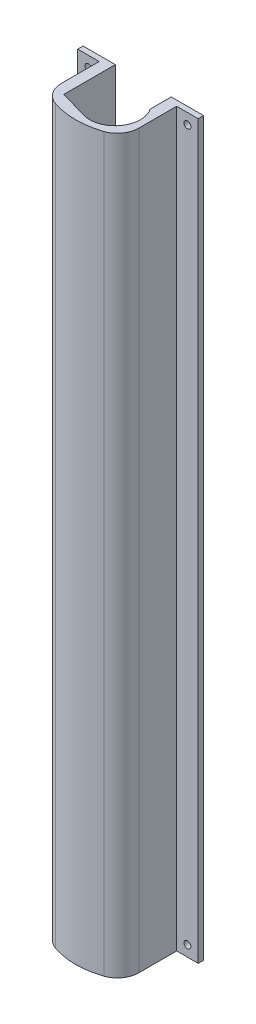
ISO-10303-21;
HEADER;
FILE_DESCRIPTION(('STEP AP214'),'2;1');
FILE_NAME('part.step','',(''),(''),'','','');
FILE_SCHEMA(('AUTOMOTIVE_DESIGN { 1 0 10303 214 1 1 1 1 }'));
ENDSEC;
DATA;
#1=APPLICATION_CONTEXT('core data for automotive mechanical design processes');
#2=APPLICATION_PROTOCOL_DEFINITION('international standard','automotive_design',2000,#1);
#3=PRODUCT_CONTEXT('',#1,'mechanical');
#4=PRODUCT('Part','Part','',(#3));
#5=PRODUCT_RELATED_PRODUCT_CATEGORY('part','',(#4));
#6=PRODUCT_DEFINITION_FORMATION('','',#4);
#7=PRODUCT_DEFINITION_CONTEXT('part definition',#1,'design');
#8=PRODUCT_DEFINITION('design','',#6,#7);
#9=PRODUCT_DEFINITION_SHAPE('','',#8);
#10=(LENGTH_UNIT() NAMED_UNIT(*) SI_UNIT(.MILLI.,.METRE.));
#11=(NAMED_UNIT(*) PLANE_ANGLE_UNIT() SI_UNIT($,.RADIAN.));
#12=(NAMED_UNIT(*) SI_UNIT($,.STERADIAN.) SOLID_ANGLE_UNIT());
#13=UNCERTAINTY_MEASURE_WITH_UNIT(LENGTH_MEASURE(1.E-05),#10,'distance_accuracy_value','');
#14=(GEOMETRIC_REPRESENTATION_CONTEXT(3) GLOBAL_UNCERTAINTY_ASSIGNED_CONTEXT((#13)) GLOBAL_UNIT_ASSIGNED_CONTEXT((#10,
#11,#12)) REPRESENTATION_CONTEXT('',''));
#15=CARTESIAN_POINT('',(0.,0.,0.));
#16=DIRECTION('',(0.,0.,1.));
#17=DIRECTION('',(1.,0.,0.));
#18=AXIS2_PLACEMENT_3D('',#15,#16,#17);
#19=CARTESIAN_POINT('',(-8.97623925243641,269.875,-3.02552306667417));
#20=DIRECTION('',(-1.,0.,0.));
#21=DIRECTION('',(0.,0.,1.));
#22=AXIS2_PLACEMENT_3D('',#19,#20,#21);
#23=PLANE('',#22);
#24=DIRECTION('',(0.,0.,-1.));
#25=VECTOR('',#24,1.);
#26=CARTESIAN_POINT('',(-8.97623925243641,161.925,-3.02552306667417));
#27=LINE('',#26,#25);
#28=CARTESIAN_POINT('',(-8.97623925243641,161.925,1.80050933441853));
#29=VERTEX_POINT('',#28);
#30=CARTESIAN_POINT('',(-8.97623925243641,161.925,-5.79920128845679));
#31=VERTEX_POINT('',#30);
#32=EDGE_CURVE('E160',#29,#31,#27,.T.);
#33=ORIENTED_EDGE('',*,*,#32,.T.);
#34=DIRECTION('',(0.,-1.,0.));
#35=VECTOR('',#34,1.);
#36=CARTESIAN_POINT('',(-8.97623925243641,269.875,-5.79920128845679));
#37=LINE('',#36,#35);
#38=CARTESIAN_POINT('',(-8.97623925243641,269.875,-5.79920128845679));
#39=VERTEX_POINT('',#38);
#40=EDGE_CURVE('E159',#39,#31,#37,.T.);
#41=ORIENTED_EDGE('',*,*,#40,.F.);
#42=DIRECTION('',(0.,0.,-1.));
#43=VECTOR('',#42,1.);
#44=CARTESIAN_POINT('',(-8.97623925243641,269.875,-3.02552306667417));
#45=LINE('',#44,#43);
#46=CARTESIAN_POINT('',(-8.97623925243641,269.875,1.80050933441853));
#47=VERTEX_POINT('',#46);
#48=EDGE_CURVE('E145',#47,#39,#45,.T.);
#49=ORIENTED_EDGE('',*,*,#48,.F.);
#50=DIRECTION('',(0.,-1.,0.));
#51=VECTOR('',#50,1.);
#52=CARTESIAN_POINT('',(-8.97623925243641,269.875,1.80050933441853));
#53=LINE('',#52,#51);
#54=EDGE_CURVE('E193',#47,#29,#53,.T.);
#55=ORIENTED_EDGE('',*,*,#54,.T.);
#56=EDGE_LOOP('',(#33,#41,#49,#55));
#57=FACE_BOUND('',#56,.T.);
#58=ADVANCED_FACE('F37',(#57),#23,.F.);
#59=CARTESIAN_POINT('',(-13.7387392524364,269.875,-5.79920128845679));
#60=DIRECTION('',(0.,0.,1.));
#61=DIRECTION('',(1.,0.,0.));
#62=AXIS2_PLACEMENT_3D('',#59,#60,#61);
#63=PLANE('',#62);
#64=CARTESIAN_POINT('',(-12.1512392524364,163.5125,-5.79920128845679));
#65=DIRECTION('',(0.,0.,1.));
#66=DIRECTION('',(1.,0.,0.));
#67=AXIS2_PLACEMENT_3D('',#64,#65,#66);
#68=CIRCLE('',#67,0.508);
#69=CARTESIAN_POINT('',(-11.6432392524364,163.5125,-5.79920128845679));
#70=VERTEX_POINT('',#69);
#71=EDGE_CURVE('E491',#70,#70,#68,.T.);
#72=ORIENTED_EDGE('',*,*,#71,.T.);
#73=EDGE_LOOP('',(#72));
#74=FACE_BOUND('',#73,.T.);
#75=CARTESIAN_POINT('',(-12.1512392524364,268.2875,-5.79920128845679));
#76=DIRECTION('',(0.,0.,1.));
#77=DIRECTION('',(1.,0.,0.));
#78=AXIS2_PLACEMENT_3D('',#75,#76,#77);
#79=CIRCLE('',#78,0.508000000000003);
#80=CARTESIAN_POINT('',(-11.6432392524364,268.2875,-5.79920128845679));
#81=VERTEX_POINT('',#80);
#82=EDGE_CURVE('E196',#81,#81,#79,.T.);
#83=ORIENTED_EDGE('',*,*,#82,.T.);
#84=EDGE_LOOP('',(#83));
#85=FACE_BOUND('',#84,.T.);
#86=DIRECTION('',(-1.,0.,0.));
#87=VECTOR('',#86,1.);
#88=CARTESIAN_POINT('',(-13.7387392524364,161.925,-5.79920128845679));
#89=LINE('',#88,#87);
#90=CARTESIAN_POINT('',(-13.7387392524364,161.925,-5.79920128845679));
#91=VERTEX_POINT('',#90);
#92=EDGE_CURVE('E195',#31,#91,#89,.T.);
#93=ORIENTED_EDGE('',*,*,#92,.T.);
#94=DIRECTION('',(0.,-1.,0.));
#95=VECTOR('',#94,1.);
#96=CARTESIAN_POINT('',(-13.7387392524364,269.875,-5.79920128845679));
#97=LINE('',#96,#95);
#98=CARTESIAN_POINT('',(-13.7387392524364,269.875,-5.79920128845679));
#99=VERTEX_POINT('',#98);
#100=EDGE_CURVE('E164',#99,#91,#97,.T.);
#101=ORIENTED_EDGE('',*,*,#100,.F.);
#102=DIRECTION('',(-1.,0.,0.));
#103=VECTOR('',#102,1.);
#104=CARTESIAN_POINT('',(-13.7387392524364,269.875,-5.79920128845679));
#105=LINE('',#104,#103);
#106=EDGE_CURVE('E149',#39,#99,#105,.T.);
#107=ORIENTED_EDGE('',*,*,#106,.F.);
#108=ORIENTED_EDGE('',*,*,#40,.T.);
#109=EDGE_LOOP('',(#93,#101,#107,#108));
#110=FACE_BOUND('',#109,.T.);
#111=ADVANCED_FACE('F166',(#74,#85,#110),#63,.F.);
#112=CARTESIAN_POINT('',(-13.7387392524364,269.875,-5.79920128845679));
#113=DIRECTION('',(1.,0.,0.));
#114=DIRECTION('',(0.,0.,-1.));
#115=AXIS2_PLACEMENT_3D('',#112,#113,#114);
#116=PLANE('',#115);
#117=DIRECTION('',(0.,0.,1.));
#118=VECTOR('',#117,1.);
#119=CARTESIAN_POINT('',(-13.7387392524364,161.925,-5.79920128845679));
#120=LINE('',#119,#118);
#121=CARTESIAN_POINT('',(-13.7387392524364,161.925,-5.00545128845679));
#122=VERTEX_POINT('',#121);
#123=EDGE_CURVE('E198',#91,#122,#120,.T.);
#124=ORIENTED_EDGE('',*,*,#123,.T.);
#125=DIRECTION('',(0.,-1.,0.));
#126=VECTOR('',#125,1.);
#127=CARTESIAN_POINT('',(-13.7387392524364,269.875,-5.00545128845679));
#128=LINE('',#127,#126);
#129=CARTESIAN_POINT('',(-13.7387392524364,269.875,-5.00545128845679));
#130=VERTEX_POINT('',#129);
#131=EDGE_CURVE('E242',#130,#122,#128,.T.);
#132=ORIENTED_EDGE('',*,*,#131,.F.);
#133=DIRECTION('',(0.,0.,1.));
#134=VECTOR('',#133,1.);
#135=CARTESIAN_POINT('',(-13.7387392524364,269.875,-5.79920128845679));
#136=LINE('',#135,#134);
#137=EDGE_CURVE('E169',#99,#130,#136,.T.);
#138=ORIENTED_EDGE('',*,*,#137,.F.);
#139=ORIENTED_EDGE('',*,*,#100,.T.);
#140=EDGE_LOOP('',(#124,#132,#138,#139));
#141=FACE_BOUND('',#140,.T.);
#142=ADVANCED_FACE('F285',(#141),#116,.F.);
#143=CARTESIAN_POINT('',(-13.7387392524364,269.875,-5.00545128845679));
#144=DIRECTION('',(0.,0.,-1.));
#145=DIRECTION('',(-1.,0.,0.));
#146=AXIS2_PLACEMENT_3D('',#143,#144,#145);
#147=PLANE('',#146);
#148=CARTESIAN_POINT('',(-12.1512392524364,163.5125,-5.00545128845679));
#149=DIRECTION('',(0.,0.,1.));
#150=DIRECTION('',(1.,0.,0.));
#151=AXIS2_PLACEMENT_3D('',#148,#149,#150);
#152=CIRCLE('',#151,0.508);
#153=CARTESIAN_POINT('',(-11.6432392524364,163.5125,-5.00545128845679));
#154=VERTEX_POINT('',#153);
#155=EDGE_CURVE('E495',#154,#154,#152,.T.);
#156=ORIENTED_EDGE('',*,*,#155,.F.);
#157=EDGE_LOOP('',(#156));
#158=FACE_BOUND('',#157,.T.);
#159=CARTESIAN_POINT('',(-12.1512392524364,268.2875,-5.00545128845679));
#160=DIRECTION('',(0.,0.,1.));
#161=DIRECTION('',(1.,0.,0.));
#162=AXIS2_PLACEMENT_3D('',#159,#160,#161);
#163=CIRCLE('',#162,0.508000000000003);
#164=CARTESIAN_POINT('',(-11.6432392524364,268.2875,-5.00545128845679));
#165=VERTEX_POINT('',#164);
#166=EDGE_CURVE('E494',#165,#165,#163,.T.);
#167=ORIENTED_EDGE('',*,*,#166,.F.);
#168=EDGE_LOOP('',(#167));
#169=FACE_BOUND('',#168,.T.);
#170=DIRECTION('',(1.,0.,0.));
#171=VECTOR('',#170,1.);
#172=CARTESIAN_POINT('',(-13.7387392524364,161.925,-5.00545128845679));
#173=LINE('',#172,#171);
#174=CARTESIAN_POINT('',(-10.5637392524364,161.925,-5.00545128845679));
#175=VERTEX_POINT('',#174);
#176=EDGE_CURVE('E200',#122,#175,#173,.T.);
#177=ORIENTED_EDGE('',*,*,#176,.T.);
#178=DIRECTION('',(0.,-1.,0.));
#179=VECTOR('',#178,1.);
#180=CARTESIAN_POINT('',(-10.5637392524364,269.875,-5.00545128845679));
#181=LINE('',#180,#179);
#182=CARTESIAN_POINT('',(-10.5637392524364,269.875,-5.00545128845679));
#183=VERTEX_POINT('',#182);
#184=EDGE_CURVE('E239',#183,#175,#181,.T.);
#185=ORIENTED_EDGE('',*,*,#184,.F.);
#186=DIRECTION('',(1.,0.,0.));
#187=VECTOR('',#186,1.);
#188=CARTESIAN_POINT('',(-13.7387392524364,269.875,-5.00545128845679));
#189=LINE('',#188,#187);
#190=EDGE_CURVE('E171',#130,#183,#189,.T.);
#191=ORIENTED_EDGE('',*,*,#190,.F.);
#192=ORIENTED_EDGE('',*,*,#131,.T.);
#193=EDGE_LOOP('',(#177,#185,#191,#192));
#194=FACE_BOUND('',#193,.T.);
#195=ADVANCED_FACE('F281',(#158,#169,#194),#147,.F.);
#196=CARTESIAN_POINT('',(-10.5637392524364,269.875,-5.00545128845679));
#197=DIRECTION('',(1.,0.,0.));
#198=DIRECTION('',(0.,0.,-1.));
#199=AXIS2_PLACEMENT_3D('',#196,#197,#198);
#200=PLANE('',#199);
#201=DIRECTION('',(0.,0.,1.));
#202=VECTOR('',#201,1.);
#203=CARTESIAN_POINT('',(-10.5637392524364,161.925,-5.00545128845679));
#204=LINE('',#203,#202);
#205=CARTESIAN_POINT('',(-10.5637392524364,161.925,0.584095881120875));
#206=VERTEX_POINT('',#205);
#207=EDGE_CURVE('E202',#175,#206,#204,.T.);
#208=ORIENTED_EDGE('',*,*,#207,.T.);
#209=DIRECTION('',(0.,-1.,0.));
#210=VECTOR('',#209,1.);
#211=CARTESIAN_POINT('',(-10.5637392524364,269.875,0.584095881120875));
#212=LINE('',#211,#210);
#213=CARTESIAN_POINT('',(-10.5637392524364,269.875,0.584095881120875));
#214=VERTEX_POINT('',#213);
#215=EDGE_CURVE('E11',#206,#214,#212,.F.);
#216=ORIENTED_EDGE('',*,*,#215,.T.);
#217=DIRECTION('',(0.,0.,1.));
#218=VECTOR('',#217,1.);
#219=CARTESIAN_POINT('',(-10.5637392524364,269.875,-5.00545128845679));
#220=LINE('',#219,#218);
#221=EDGE_CURVE('E176',#183,#214,#220,.T.);
#222=ORIENTED_EDGE('',*,*,#221,.F.);
#223=ORIENTED_EDGE('',*,*,#184,.T.);
#224=EDGE_LOOP('',(#208,#216,#222,#223));
#225=FACE_BOUND('',#224,.T.);
#226=ADVANCED_FACE('F277',(#225),#200,.F.);
#227=CARTESIAN_POINT('',(-4.8487392524364,269.875,-6.93603086315677));
#228=DIRECTION('',(0.,-1.,0.));
#229=DIRECTION('',(0.,0.,-1.));
#230=AXIS2_PLACEMENT_3D('',#227,#228,#229);
#231=CYLINDRICAL_SURFACE('',#230,11.1125);
#232=CARTESIAN_POINT('',(-4.8487392524364,161.925,-6.93603086315677));
#233=DIRECTION('',(0.,1.,0.));
#234=DIRECTION('',(0.,0.,1.));
#235=AXIS2_PLACEMENT_3D('',#232,#233,#234);
#236=CIRCLE('',#235,11.1125);
#237=CARTESIAN_POINT('',(-8.40473925243641,161.925,3.59214657883194));
#238=VERTEX_POINT('',#237);
#239=CARTESIAN_POINT('',(-1.2927392524364,161.925,3.59214657883194));
#240=VERTEX_POINT('',#239);
#241=EDGE_CURVE('E204',#238,#240,#236,.T.);
#242=ORIENTED_EDGE('',*,*,#241,.T.);
#243=DIRECTION('',(0.,-1.,0.));
#244=VECTOR('',#243,1.);
#245=CARTESIAN_POINT('',(-1.2927392524364,269.875,3.59214657883194));
#246=LINE('',#245,#244);
#247=CARTESIAN_POINT('',(-1.2927392524364,269.875,3.59214657883194));
#248=VERTEX_POINT('',#247);
#249=EDGE_CURVE('E58',#240,#248,#246,.F.);
#250=ORIENTED_EDGE('',*,*,#249,.T.);
#251=CARTESIAN_POINT('',(-4.8487392524364,269.875,-6.93603086315677));
#252=DIRECTION('',(0.,1.,0.));
#253=DIRECTION('',(0.,0.,1.));
#254=AXIS2_PLACEMENT_3D('',#251,#252,#253);
#255=CIRCLE('',#254,11.1125);
#256=CARTESIAN_POINT('',(-8.40473925243641,269.875,3.59214657883194));
#257=VERTEX_POINT('',#256);
#258=EDGE_CURVE('E178',#257,#248,#255,.T.);
#259=ORIENTED_EDGE('',*,*,#258,.F.);
#260=DIRECTION('',(0.,-1.,0.));
#261=VECTOR('',#260,1.);
#262=CARTESIAN_POINT('',(-8.40473925243641,269.875,3.59214657883194));
#263=LINE('',#262,#261);
#264=EDGE_CURVE('E252',#257,#238,#263,.T.);
#265=ORIENTED_EDGE('',*,*,#264,.T.);
#266=EDGE_LOOP('',(#242,#250,#259,#265));
#267=FACE_BOUND('',#266,.T.);
#268=ADVANCED_FACE('F271',(#267),#231,.T.);
#269=CARTESIAN_POINT('',(0.866260747563594,269.875,-5.00545128845679));
#270=DIRECTION('',(-1.,0.,0.));
#271=DIRECTION('',(0.,0.,1.));
#272=AXIS2_PLACEMENT_3D('',#269,#270,#271);
#273=PLANE('',#272);
#274=DIRECTION('',(0.,0.,-1.));
#275=VECTOR('',#274,1.);
#276=CARTESIAN_POINT('',(0.866260747563594,269.875,-5.00545128845679));
#277=LINE('',#276,#275);
#278=CARTESIAN_POINT('',(0.866260747563595,269.875,0.584095881120875));
#279=VERTEX_POINT('',#278);
#280=CARTESIAN_POINT('',(0.866260747563594,269.875,-5.00545128845679));
#281=VERTEX_POINT('',#280);
#282=EDGE_CURVE('E180',#279,#281,#277,.T.);
#283=ORIENTED_EDGE('',*,*,#282,.F.);
#284=DIRECTION('',(0.,-1.,0.));
#285=VECTOR('',#284,1.);
#286=CARTESIAN_POINT('',(0.866260747563595,269.875,0.584095881120875));
#287=LINE('',#286,#285);
#288=CARTESIAN_POINT('',(0.866260747563595,161.925,0.584095881120875));
#289=VERTEX_POINT('',#288);
#290=EDGE_CURVE('E163',#279,#289,#287,.T.);
#291=ORIENTED_EDGE('',*,*,#290,.T.);
#292=DIRECTION('',(0.,0.,-1.));
#293=VECTOR('',#292,1.);
#294=CARTESIAN_POINT('',(0.866260747563594,161.925,-5.00545128845679));
#295=LINE('',#294,#293);
#296=CARTESIAN_POINT('',(0.866260747563594,161.925,-5.00545128845679));
#297=VERTEX_POINT('',#296);
#298=EDGE_CURVE('E206',#289,#297,#295,.T.);
#299=ORIENTED_EDGE('',*,*,#298,.T.);
#300=DIRECTION('',(0.,-1.,0.));
#301=VECTOR('',#300,1.);
#302=CARTESIAN_POINT('',(0.866260747563594,269.875,-5.00545128845679));
#303=LINE('',#302,#301);
#304=EDGE_CURVE('E236',#281,#297,#303,.T.);
#305=ORIENTED_EDGE('',*,*,#304,.F.);
#306=EDGE_LOOP('',(#283,#291,#299,#305));
#307=FACE_BOUND('',#306,.T.);
#308=ADVANCED_FACE('F263',(#307),#273,.F.);
#309=CARTESIAN_POINT('',(4.04126074756359,269.875,-5.00545128845679));
#310=DIRECTION('',(0.,0.,-1.));
#311=DIRECTION('',(-1.,0.,0.));
#312=AXIS2_PLACEMENT_3D('',#309,#310,#311);
#313=PLANE('',#312);
#314=CARTESIAN_POINT('',(2.45376074756359,268.2875,-5.00545128845679));
#315=DIRECTION('',(0.,0.,1.));
#316=DIRECTION('',(1.,0.,0.));
#317=AXIS2_PLACEMENT_3D('',#314,#315,#316);
#318=CIRCLE('',#317,0.508000000000004);
#319=CARTESIAN_POINT('',(2.9617607475636,268.2875,-5.00545128845679));
#320=VERTEX_POINT('',#319);
#321=EDGE_CURVE('E488',#320,#320,#318,.T.);
#322=ORIENTED_EDGE('',*,*,#321,.F.);
#323=EDGE_LOOP('',(#322));
#324=FACE_BOUND('',#323,.T.);
#325=CARTESIAN_POINT('',(2.45376074756359,163.5125,-5.00545128845679));
#326=DIRECTION('',(0.,0.,1.));
#327=DIRECTION('',(1.,0.,0.));
#328=AXIS2_PLACEMENT_3D('',#325,#326,#327);
#329=CIRCLE('',#328,0.508);
#330=CARTESIAN_POINT('',(2.96176074756359,163.5125,-5.00545128845679));
#331=VERTEX_POINT('',#330);
#332=EDGE_CURVE('E485',#331,#331,#329,.T.);
#333=ORIENTED_EDGE('',*,*,#332,.F.);
#334=EDGE_LOOP('',(#333));
#335=FACE_BOUND('',#334,.T.);
#336=DIRECTION('',(1.,0.,0.));
#337=VECTOR('',#336,1.);
#338=CARTESIAN_POINT('',(4.04126074756359,161.925,-5.00545128845679));
#339=LINE('',#338,#337);
#340=CARTESIAN_POINT('',(4.04126074756359,161.925,-5.00545128845679));
#341=VERTEX_POINT('',#340);
#342=EDGE_CURVE('E208',#297,#341,#339,.T.);
#343=ORIENTED_EDGE('',*,*,#342,.T.);
#344=DIRECTION('',(0.,-1.,0.));
#345=VECTOR('',#344,1.);
#346=CARTESIAN_POINT('',(4.04126074756359,269.875,-5.00545128845679));
#347=LINE('',#346,#345);
#348=CARTESIAN_POINT('',(4.04126074756359,269.875,-5.00545128845679));
#349=VERTEX_POINT('',#348);
#350=EDGE_CURVE('E233',#349,#341,#347,.T.);
#351=ORIENTED_EDGE('',*,*,#350,.F.);
#352=DIRECTION('',(1.,0.,0.));
#353=VECTOR('',#352,1.);
#354=CARTESIAN_POINT('',(4.04126074756359,269.875,-5.00545128845679));
#355=LINE('',#354,#353);
#356=EDGE_CURVE('E182',#281,#349,#355,.T.);
#357=ORIENTED_EDGE('',*,*,#356,.F.);
#358=ORIENTED_EDGE('',*,*,#304,.T.);
#359=EDGE_LOOP('',(#343,#351,#357,#358));
#360=FACE_BOUND('',#359,.T.);
#361=ADVANCED_FACE('F346',(#324,#335,#360),#313,.F.);
#362=CARTESIAN_POINT('',(4.04126074756359,269.875,-5.79920128845679));
#363=DIRECTION('',(-1.,0.,0.));
#364=DIRECTION('',(0.,0.,1.));
#365=AXIS2_PLACEMENT_3D('',#362,#363,#364);
#366=PLANE('',#365);
#367=DIRECTION('',(0.,0.,-1.));
#368=VECTOR('',#367,1.);
#369=CARTESIAN_POINT('',(4.04126074756359,161.925,-5.79920128845679));
#370=LINE('',#369,#368);
#371=CARTESIAN_POINT('',(4.04126074756359,161.925,-5.79920128845679));
#372=VERTEX_POINT('',#371);
#373=EDGE_CURVE('E210',#341,#372,#370,.T.);
#374=ORIENTED_EDGE('',*,*,#373,.T.);
#375=DIRECTION('',(0.,-1.,0.));
#376=VECTOR('',#375,1.);
#377=CARTESIAN_POINT('',(4.04126074756359,269.875,-5.79920128845679));
#378=LINE('',#377,#376);
#379=CARTESIAN_POINT('',(4.04126074756359,269.875,-5.79920128845679));
#380=VERTEX_POINT('',#379);
#381=EDGE_CURVE('E230',#380,#372,#378,.T.);
#382=ORIENTED_EDGE('',*,*,#381,.F.);
#383=DIRECTION('',(0.,0.,-1.));
#384=VECTOR('',#383,1.);
#385=CARTESIAN_POINT('',(4.04126074756359,269.875,-5.79920128845679));
#386=LINE('',#385,#384);
#387=EDGE_CURVE('E184',#349,#380,#386,.T.);
#388=ORIENTED_EDGE('',*,*,#387,.F.);
#389=ORIENTED_EDGE('',*,*,#350,.T.);
#390=EDGE_LOOP('',(#374,#382,#388,#389));
#391=FACE_BOUND('',#390,.T.);
#392=ADVANCED_FACE('F342',(#391),#366,.F.);
#393=CARTESIAN_POINT('',(-0.721239252436406,269.875,-5.79920128845679));
#394=DIRECTION('',(0.,0.,1.));
#395=DIRECTION('',(1.,0.,0.));
#396=AXIS2_PLACEMENT_3D('',#393,#394,#395);
#397=PLANE('',#396);
#398=CARTESIAN_POINT('',(2.45376074756359,268.2875,-5.79920128845679));
#399=DIRECTION('',(0.,0.,1.));
#400=DIRECTION('',(1.,0.,0.));
#401=AXIS2_PLACEMENT_3D('',#398,#399,#400);
#402=CIRCLE('',#401,0.508000000000004);
#403=CARTESIAN_POINT('',(2.9617607475636,268.2875,-5.79920128845679));
#404=VERTEX_POINT('',#403);
#405=EDGE_CURVE('E498',#404,#404,#402,.T.);
#406=ORIENTED_EDGE('',*,*,#405,.T.);
#407=EDGE_LOOP('',(#406));
#408=FACE_BOUND('',#407,.T.);
#409=CARTESIAN_POINT('',(2.45376074756359,163.5125,-5.79920128845679));
#410=DIRECTION('',(0.,0.,1.));
#411=DIRECTION('',(1.,0.,0.));
#412=AXIS2_PLACEMENT_3D('',#409,#410,#411);
#413=CIRCLE('',#412,0.508);
#414=CARTESIAN_POINT('',(2.96176074756359,163.5125,-5.79920128845679));
#415=VERTEX_POINT('',#414);
#416=EDGE_CURVE('E482',#415,#415,#413,.T.);
#417=ORIENTED_EDGE('',*,*,#416,.T.);
#418=EDGE_LOOP('',(#417));
#419=FACE_BOUND('',#418,.T.);
#420=DIRECTION('',(-1.,0.,0.));
#421=VECTOR('',#420,1.);
#422=CARTESIAN_POINT('',(-0.721239252436406,161.925,-5.79920128845679));
#423=LINE('',#422,#421);
#424=CARTESIAN_POINT('',(-0.721239252436406,161.925,-5.79920128845679));
#425=VERTEX_POINT('',#424);
#426=EDGE_CURVE('E212',#372,#425,#423,.T.);
#427=ORIENTED_EDGE('',*,*,#426,.T.);
#428=DIRECTION('',(0.,-1.,0.));
#429=VECTOR('',#428,1.);
#430=CARTESIAN_POINT('',(-0.721239252436406,269.875,-5.79920128845679));
#431=LINE('',#430,#429);
#432=CARTESIAN_POINT('',(-0.721239252436406,269.875,-5.79920128845679));
#433=VERTEX_POINT('',#432);
#434=EDGE_CURVE('E227',#433,#425,#431,.T.);
#435=ORIENTED_EDGE('',*,*,#434,.F.);
#436=DIRECTION('',(-1.,0.,0.));
#437=VECTOR('',#436,1.);
#438=CARTESIAN_POINT('',(-0.721239252436406,269.875,-5.79920128845679));
#439=LINE('',#438,#437);
#440=EDGE_CURVE('E186',#380,#433,#439,.T.);
#441=ORIENTED_EDGE('',*,*,#440,.F.);
#442=ORIENTED_EDGE('',*,*,#381,.T.);
#443=EDGE_LOOP('',(#427,#435,#441,#442));
#444=FACE_BOUND('',#443,.T.);
#445=ADVANCED_FACE('F338',(#408,#419,#444),#397,.F.);
#446=CARTESIAN_POINT('',(-0.721239252436406,269.875,-5.79920128845679));
#447=DIRECTION('',(1.,0.,0.));
#448=DIRECTION('',(0.,0.,-1.));
#449=AXIS2_PLACEMENT_3D('',#446,#447,#448);
#450=PLANE('',#449);
#451=DIRECTION('',(0.,0.,1.));
#452=VECTOR('',#451,1.);
#453=CARTESIAN_POINT('',(-0.721239252436406,161.925,-5.79920128845679));
#454=LINE('',#453,#452);
#455=CARTESIAN_POINT('',(-0.721239252436403,161.925,-2.69947219080917));
#456=VERTEX_POINT('',#455);
#457=EDGE_CURVE('E214',#425,#456,#454,.T.);
#458=ORIENTED_EDGE('',*,*,#457,.T.);
#459=DIRECTION('',(0.,-1.,0.));
#460=VECTOR('',#459,1.);
#461=CARTESIAN_POINT('',(-0.721239252436403,269.875,-2.69947219080917));
#462=LINE('',#461,#460);
#463=CARTESIAN_POINT('',(-0.721239252436403,269.875,-2.69947219080917));
#464=VERTEX_POINT('',#463);
#465=EDGE_CURVE('E224',#464,#456,#462,.T.);
#466=ORIENTED_EDGE('',*,*,#465,.F.);
#467=DIRECTION('',(0.,0.,1.));
#468=VECTOR('',#467,1.);
#469=CARTESIAN_POINT('',(-0.721239252436406,269.875,-5.79920128845679));
#470=LINE('',#469,#468);
#471=EDGE_CURVE('E188',#433,#464,#470,.T.);
#472=ORIENTED_EDGE('',*,*,#471,.F.);
#473=ORIENTED_EDGE('',*,*,#434,.T.);
#474=EDGE_LOOP('',(#458,#466,#472,#473));
#475=FACE_BOUND('',#474,.T.);
#476=ADVANCED_FACE('F334',(#475),#450,.F.);
#477=CARTESIAN_POINT('',(-3.8327392524364,269.875,-0.612523066674167));
#478=DIRECTION('',(0.,-1.,0.));
#479=DIRECTION('',(0.,0.,-1.));
#480=AXIS2_PLACEMENT_3D('',#477,#478,#479);
#481=CYLINDRICAL_SURFACE('',#480,3.74657028450393);
#482=CARTESIAN_POINT('',(-3.8327392524364,161.925,-0.612523066674167));
#483=DIRECTION('',(0.,-1.,0.));
#484=DIRECTION('',(0.,0.,1.));
#485=AXIS2_PLACEMENT_3D('',#482,#483,#484);
#486=CIRCLE('',#485,3.74657028450393);
#487=CARTESIAN_POINT('',(-4.87324414830084,161.925,2.98666273825588));
#488=VERTEX_POINT('',#487);
#489=EDGE_CURVE('E216',#456,#488,#486,.T.);
#490=ORIENTED_EDGE('',*,*,#489,.T.);
#491=DIRECTION('',(0.,-1.,0.));
#492=VECTOR('',#491,1.);
#493=CARTESIAN_POINT('',(-4.87324414830084,269.875,2.98666273825588));
#494=LINE('',#493,#492);
#495=CARTESIAN_POINT('',(-4.87324414830084,269.875,2.98666273825588));
#496=VERTEX_POINT('',#495);
#497=EDGE_CURVE('E221',#496,#488,#494,.T.);
#498=ORIENTED_EDGE('',*,*,#497,.F.);
#499=CARTESIAN_POINT('',(-3.8327392524364,269.875,-0.612523066674167));
#500=DIRECTION('',(0.,-1.,0.));
#501=DIRECTION('',(0.,0.,1.));
#502=AXIS2_PLACEMENT_3D('',#499,#500,#501);
#503=CIRCLE('',#502,3.74657028450393);
#504=EDGE_CURVE('E190',#464,#496,#503,.T.);
#505=ORIENTED_EDGE('',*,*,#504,.F.);
#506=ORIENTED_EDGE('',*,*,#465,.T.);
#507=EDGE_LOOP('',(#490,#498,#505,#506));
#508=FACE_BOUND('',#507,.T.);
#509=ADVANCED_FACE('F330',(#508),#481,.F.);
#510=CARTESIAN_POINT('',(-8.97623925243641,269.875,1.80050933441853));
#511=DIRECTION('',(-0.27772197419278,0.,0.960661493477523));
#512=DIRECTION('',(0.960661493477523,0.,0.27772197419278));
#513=AXIS2_PLACEMENT_3D('',#510,#511,#512);
#514=PLANE('',#513);
#515=DIRECTION('',(-0.960661493477523,0.,-0.27772197419278));
#516=VECTOR('',#515,1.);
#517=CARTESIAN_POINT('',(-8.97623925243641,161.925,1.80050933441853));
#518=LINE('',#517,#516);
#519=EDGE_CURVE('E156',#488,#29,#518,.T.);
#520=ORIENTED_EDGE('',*,*,#519,.T.);
#521=ORIENTED_EDGE('',*,*,#54,.F.);
#522=DIRECTION('',(-0.960661493477523,0.,-0.27772197419278));
#523=VECTOR('',#522,1.);
#524=CARTESIAN_POINT('',(-8.97623925243641,269.875,1.80050933441853));
#525=LINE('',#524,#523);
#526=EDGE_CURVE('E152',#496,#47,#525,.T.);
#527=ORIENTED_EDGE('',*,*,#526,.F.);
#528=ORIENTED_EDGE('',*,*,#497,.T.);
#529=EDGE_LOOP('',(#520,#521,#527,#528));
#530=FACE_BOUND('',#529,.T.);
#531=ADVANCED_FACE('F325',(#530),#514,.F.);
#532=CARTESIAN_POINT('',(-3.8327392524364,269.875,-0.612523066674167));
#533=DIRECTION('',(0.,1.,0.));
#534=DIRECTION('',(0.,0.,1.));
#535=AXIS2_PLACEMENT_3D('',#532,#533,#534);
#536=PLANE('',#535);
#537=ORIENTED_EDGE('',*,*,#258,.T.);
#538=CARTESIAN_POINT('',(-2.3087392524364,269.875,0.584095881120875));
#539=DIRECTION('',(0.,1.,0.));
#540=DIRECTION('',(0.,0.,1.));
#541=AXIS2_PLACEMENT_3D('',#538,#539,#540);
#542=CIRCLE('',#541,3.175);
#543=EDGE_CURVE('E45',#248,#279,#542,.T.);
#544=ORIENTED_EDGE('',*,*,#543,.T.);
#545=ORIENTED_EDGE('',*,*,#282,.T.);
#546=ORIENTED_EDGE('',*,*,#356,.T.);
#547=ORIENTED_EDGE('',*,*,#387,.T.);
#548=ORIENTED_EDGE('',*,*,#440,.T.);
#549=ORIENTED_EDGE('',*,*,#471,.T.);
#550=ORIENTED_EDGE('',*,*,#504,.T.);
#551=ORIENTED_EDGE('',*,*,#526,.T.);
#552=ORIENTED_EDGE('',*,*,#48,.T.);
#553=ORIENTED_EDGE('',*,*,#106,.T.);
#554=ORIENTED_EDGE('',*,*,#137,.T.);
#555=ORIENTED_EDGE('',*,*,#190,.T.);
#556=ORIENTED_EDGE('',*,*,#221,.T.);
#557=CARTESIAN_POINT('',(-7.3887392524364,269.875,0.584095881120875));
#558=DIRECTION('',(0.,1.,0.));
#559=DIRECTION('',(0.,0.,1.));
#560=AXIS2_PLACEMENT_3D('',#557,#558,#559);
#561=CIRCLE('',#560,3.175);
#562=EDGE_CURVE('E256',#214,#257,#561,.T.);
#563=ORIENTED_EDGE('',*,*,#562,.T.);
#564=EDGE_LOOP('',(#537,#544,#545,#546,#547,#548,#549,#550,#551,#552,#553,#554,#555,#556,#563));
#565=FACE_BOUND('',#564,.T.);
#566=ADVANCED_FACE('F147',(#565),#536,.T.);
#567=CARTESIAN_POINT('',(-3.8327392524364,161.925,-0.612523066674167));
#568=DIRECTION('',(0.,1.,0.));
#569=DIRECTION('',(0.,0.,1.));
#570=AXIS2_PLACEMENT_3D('',#567,#568,#569);
#571=PLANE('',#570);
#572=ORIENTED_EDGE('',*,*,#298,.F.);
#573=CARTESIAN_POINT('',(-2.3087392524364,161.925,0.584095881120875));
#574=DIRECTION('',(0.,1.,0.));
#575=DIRECTION('',(0.,0.,1.));
#576=AXIS2_PLACEMENT_3D('',#573,#574,#575);
#577=CIRCLE('',#576,3.175);
#578=EDGE_CURVE('E250',#289,#240,#577,.F.);
#579=ORIENTED_EDGE('',*,*,#578,.T.);
#580=ORIENTED_EDGE('',*,*,#241,.F.);
#581=CARTESIAN_POINT('',(-7.3887392524364,161.925,0.584095881120875));
#582=DIRECTION('',(0.,1.,0.));
#583=DIRECTION('',(0.,0.,1.));
#584=AXIS2_PLACEMENT_3D('',#581,#582,#583);
#585=CIRCLE('',#584,3.175);
#586=EDGE_CURVE('E248',#238,#206,#585,.F.);
#587=ORIENTED_EDGE('',*,*,#586,.T.);
#588=ORIENTED_EDGE('',*,*,#207,.F.);
#589=ORIENTED_EDGE('',*,*,#176,.F.);
#590=ORIENTED_EDGE('',*,*,#123,.F.);
#591=ORIENTED_EDGE('',*,*,#92,.F.);
#592=ORIENTED_EDGE('',*,*,#32,.F.);
#593=ORIENTED_EDGE('',*,*,#519,.F.);
#594=ORIENTED_EDGE('',*,*,#489,.F.);
#595=ORIENTED_EDGE('',*,*,#457,.F.);
#596=ORIENTED_EDGE('',*,*,#426,.F.);
#597=ORIENTED_EDGE('',*,*,#373,.F.);
#598=ORIENTED_EDGE('',*,*,#342,.F.);
#599=EDGE_LOOP('',(#572,#579,#580,#587,#588,#589,#590,#591,#592,#593,#594,#595,#596,#597,#598));
#600=FACE_BOUND('',#599,.T.);
#601=ADVANCED_FACE('F269',(#600),#571,.F.);
#602=CARTESIAN_POINT('',(2.45376074756359,163.5125,-5.79920128845679));
#603=DIRECTION('',(0.,0.,1.));
#604=DIRECTION('',(1.,0.,0.));
#605=AXIS2_PLACEMENT_3D('',#602,#603,#604);
#606=CYLINDRICAL_SURFACE('',#605,0.508);
#607=ORIENTED_EDGE('',*,*,#416,.F.);
#608=EDGE_LOOP('',(#607));
#609=FACE_BOUND('',#608,.T.);
#610=ORIENTED_EDGE('',*,*,#332,.T.);
#611=EDGE_LOOP('',(#610));
#612=FACE_BOUND('',#611,.T.);
#613=ADVANCED_FACE('F319',(#609,#612),#606,.F.);
#614=CARTESIAN_POINT('',(2.45376074756359,268.2875,-5.79920128845679));
#615=DIRECTION('',(0.,0.,1.));
#616=DIRECTION('',(1.,0.,0.));
#617=AXIS2_PLACEMENT_3D('',#614,#615,#616);
#618=CYLINDRICAL_SURFACE('',#617,0.508000000000004);
#619=ORIENTED_EDGE('',*,*,#405,.F.);
#620=EDGE_LOOP('',(#619));
#621=FACE_BOUND('',#620,.T.);
#622=ORIENTED_EDGE('',*,*,#321,.T.);
#623=EDGE_LOOP('',(#622));
#624=FACE_BOUND('',#623,.T.);
#625=ADVANCED_FACE('F312',(#621,#624),#618,.F.);
#626=CARTESIAN_POINT('',(-12.1512392524364,268.2875,-5.79920128845679));
#627=DIRECTION('',(0.,0.,1.));
#628=DIRECTION('',(1.,0.,0.));
#629=AXIS2_PLACEMENT_3D('',#626,#627,#628);
#630=CYLINDRICAL_SURFACE('',#629,0.508000000000003);
#631=ORIENTED_EDGE('',*,*,#82,.F.);
#632=EDGE_LOOP('',(#631));
#633=FACE_BOUND('',#632,.T.);
#634=ORIENTED_EDGE('',*,*,#166,.T.);
#635=EDGE_LOOP('',(#634));
#636=FACE_BOUND('',#635,.T.);
#637=ADVANCED_FACE('F306',(#633,#636),#630,.F.);
#638=CARTESIAN_POINT('',(-12.1512392524364,163.5125,-5.79920128845679));
#639=DIRECTION('',(0.,0.,1.));
#640=DIRECTION('',(1.,0.,0.));
#641=AXIS2_PLACEMENT_3D('',#638,#639,#640);
#642=CYLINDRICAL_SURFACE('',#641,0.508);
#643=ORIENTED_EDGE('',*,*,#71,.F.);
#644=EDGE_LOOP('',(#643));
#645=FACE_BOUND('',#644,.T.);
#646=ORIENTED_EDGE('',*,*,#155,.T.);
#647=EDGE_LOOP('',(#646));
#648=FACE_BOUND('',#647,.T.);
#649=ADVANCED_FACE('F301',(#645,#648),#642,.F.);
#650=CARTESIAN_POINT('',(-2.3087392524364,269.875,0.584095881120875));
#651=DIRECTION('',(0.,-1.,0.));
#652=DIRECTION('',(0.,0.,-1.));
#653=AXIS2_PLACEMENT_3D('',#650,#651,#652);
#654=CYLINDRICAL_SURFACE('',#653,3.175);
#655=ORIENTED_EDGE('',*,*,#543,.F.);
#656=ORIENTED_EDGE('',*,*,#249,.F.);
#657=ORIENTED_EDGE('',*,*,#578,.F.);
#658=ORIENTED_EDGE('',*,*,#290,.F.);
#659=EDGE_LOOP('',(#655,#656,#657,#658));
#660=FACE_BOUND('',#659,.T.);
#661=ADVANCED_FACE('F266',(#660),#654,.T.);
#662=CARTESIAN_POINT('',(-7.3887392524364,269.875,0.584095881120875));
#663=DIRECTION('',(0.,-1.,0.));
#664=DIRECTION('',(0.,0.,-1.));
#665=AXIS2_PLACEMENT_3D('',#662,#663,#664);
#666=CYLINDRICAL_SURFACE('',#665,3.175);
#667=ORIENTED_EDGE('',*,*,#562,.F.);
#668=ORIENTED_EDGE('',*,*,#215,.F.);
#669=ORIENTED_EDGE('',*,*,#586,.F.);
#670=ORIENTED_EDGE('',*,*,#264,.F.);
#671=EDGE_LOOP('',(#667,#668,#669,#670));
#672=FACE_BOUND('',#671,.T.);
#673=ADVANCED_FACE('F39',(#672),#666,.T.);
#674=CLOSED_SHELL('',(#58,#111,#142,#195,#226,#268,#308,#361,#392,#445,#476,#509,#531,#566,#601,
#613,#625,#637,#649,#661,#673));
#675=MANIFOLD_SOLID_BREP('B2',#674);
#676=ADVANCED_BREP_SHAPE_REPRESENTATION('',(#18,#675),#14);
#677=SHAPE_DEFINITION_REPRESENTATION(#9,#676);
ENDSEC;
END-ISO-10303-21;
